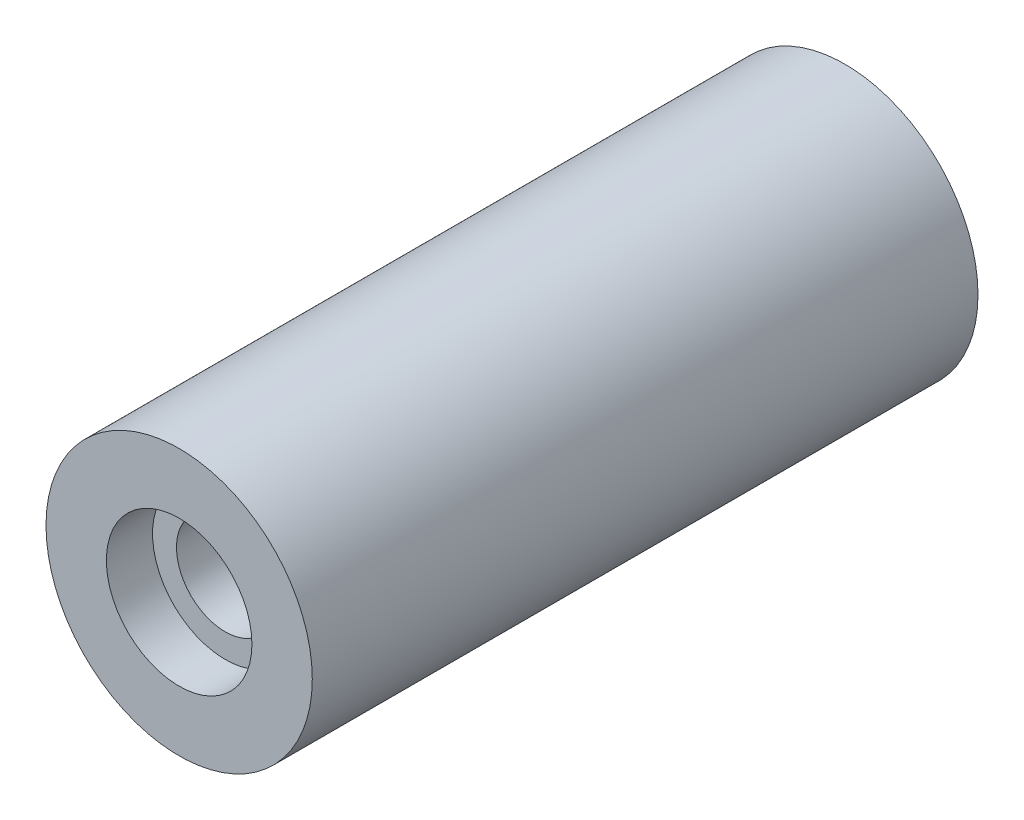
ISO-10303-21;
HEADER;
FILE_DESCRIPTION(('STEP AP214'),'2;1');
FILE_NAME('part.step','',(''),(''),'','','');
FILE_SCHEMA(('AUTOMOTIVE_DESIGN { 1 0 10303 214 1 1 1 1 }'));
ENDSEC;
DATA;
#1=APPLICATION_CONTEXT('core data for automotive mechanical design processes');
#2=APPLICATION_PROTOCOL_DEFINITION('international standard','automotive_design',2000,#1);
#3=PRODUCT_CONTEXT('',#1,'mechanical');
#4=PRODUCT('Part','Part','',(#3));
#5=PRODUCT_RELATED_PRODUCT_CATEGORY('part','',(#4));
#6=PRODUCT_DEFINITION_FORMATION('','',#4);
#7=PRODUCT_DEFINITION_CONTEXT('part definition',#1,'design');
#8=PRODUCT_DEFINITION('design','',#6,#7);
#9=PRODUCT_DEFINITION_SHAPE('','',#8);
#10=(LENGTH_UNIT() NAMED_UNIT(*) SI_UNIT(.MILLI.,.METRE.));
#11=(NAMED_UNIT(*) PLANE_ANGLE_UNIT() SI_UNIT($,.RADIAN.));
#12=(NAMED_UNIT(*) SI_UNIT($,.STERADIAN.) SOLID_ANGLE_UNIT());
#13=UNCERTAINTY_MEASURE_WITH_UNIT(LENGTH_MEASURE(1.E-05),#10,'distance_accuracy_value','');
#14=(GEOMETRIC_REPRESENTATION_CONTEXT(3) GLOBAL_UNCERTAINTY_ASSIGNED_CONTEXT((#13)) GLOBAL_UNIT_ASSIGNED_CONTEXT((#10,
#11,#12)) REPRESENTATION_CONTEXT('',''));
#15=CARTESIAN_POINT('',(0.,0.,0.));
#16=DIRECTION('',(0.,0.,1.));
#17=DIRECTION('',(1.,0.,0.));
#18=AXIS2_PLACEMENT_3D('',#15,#16,#17);
#19=CARTESIAN_POINT('',(0.,0.,75.));
#20=DIRECTION('',(0.,0.,-1.));
#21=DIRECTION('',(-1.,0.,0.));
#22=AXIS2_PLACEMENT_3D('',#19,#20,#21);
#23=CYLINDRICAL_SURFACE('',#22,15.);
#24=CARTESIAN_POINT('',(0.,0.,75.));
#25=DIRECTION('',(0.,0.,1.));
#26=DIRECTION('',(1.,0.,0.));
#27=AXIS2_PLACEMENT_3D('',#24,#25,#26);
#28=CIRCLE('',#27,15.);
#29=CARTESIAN_POINT('',(15.,0.,75.));
#30=VERTEX_POINT('',#29);
#31=EDGE_CURVE('E10',#30,#30,#28,.T.);
#32=ORIENTED_EDGE('',*,*,#31,.F.);
#33=EDGE_LOOP('',(#32));
#34=FACE_BOUND('',#33,.T.);
#35=CARTESIAN_POINT('',(0.,0.,0.));
#36=DIRECTION('',(0.,0.,1.));
#37=DIRECTION('',(1.,0.,0.));
#38=AXIS2_PLACEMENT_3D('',#35,#36,#37);
#39=CIRCLE('',#38,15.);
#40=CARTESIAN_POINT('',(15.,0.,0.));
#41=VERTEX_POINT('',#40);
#42=EDGE_CURVE('E37',#41,#41,#39,.T.);
#43=ORIENTED_EDGE('',*,*,#42,.T.);
#44=EDGE_LOOP('',(#43));
#45=FACE_BOUND('',#44,.T.);
#46=ADVANCED_FACE('F40',(#34,#45),#23,.T.);
#47=CARTESIAN_POINT('',(0.,0.,75.));
#48=DIRECTION('',(0.,0.,1.));
#49=DIRECTION('',(1.,0.,0.));
#50=AXIS2_PLACEMENT_3D('',#47,#48,#49);
#51=PLANE('',#50);
#52=CARTESIAN_POINT('',(0.,0.,75.));
#53=DIRECTION('',(0.,0.,1.));
#54=DIRECTION('',(1.,0.,0.));
#55=AXIS2_PLACEMENT_3D('',#52,#53,#54);
#56=CIRCLE('',#55,8.2);
#57=CARTESIAN_POINT('',(8.2,0.,75.));
#58=VERTEX_POINT('',#57);
#59=EDGE_CURVE('E47',#58,#58,#56,.T.);
#60=ORIENTED_EDGE('',*,*,#59,.F.);
#61=EDGE_LOOP('',(#60));
#62=FACE_BOUND('',#61,.T.);
#63=ORIENTED_EDGE('',*,*,#31,.T.);
#64=EDGE_LOOP('',(#63));
#65=FACE_BOUND('',#64,.T.);
#66=ADVANCED_FACE('F99',(#62,#65),#51,.T.);
#67=CARTESIAN_POINT('',(0.,0.,0.));
#68=DIRECTION('',(0.,0.,1.));
#69=DIRECTION('',(1.,0.,0.));
#70=AXIS2_PLACEMENT_3D('',#67,#68,#69);
#71=PLANE('',#70);
#72=CARTESIAN_POINT('',(0.,0.,0.));
#73=DIRECTION('',(0.,0.,-1.));
#74=DIRECTION('',(-1.,0.,0.));
#75=AXIS2_PLACEMENT_3D('',#72,#73,#74);
#76=CIRCLE('',#75,8.2);
#77=CARTESIAN_POINT('',(-8.2,0.,0.));
#78=VERTEX_POINT('',#77);
#79=EDGE_CURVE('E54',#78,#78,#76,.T.);
#80=ORIENTED_EDGE('',*,*,#79,.F.);
#81=EDGE_LOOP('',(#80));
#82=FACE_BOUND('',#81,.T.);
#83=ORIENTED_EDGE('',*,*,#42,.F.);
#84=EDGE_LOOP('',(#83));
#85=FACE_BOUND('',#84,.T.);
#86=ADVANCED_FACE('F96',(#82,#85),#71,.F.);
#87=CARTESIAN_POINT('',(0.,0.,69.8));
#88=DIRECTION('',(0.,0.,1.));
#89=DIRECTION('',(1.,0.,0.));
#90=AXIS2_PLACEMENT_3D('',#87,#88,#89);
#91=CYLINDRICAL_SURFACE('',#90,8.2);
#92=CARTESIAN_POINT('',(0.,0.,69.8));
#93=DIRECTION('',(0.,0.,1.));
#94=DIRECTION('',(1.,0.,0.));
#95=AXIS2_PLACEMENT_3D('',#92,#93,#94);
#96=CIRCLE('',#95,8.2);
#97=CARTESIAN_POINT('',(8.2,0.,69.8));
#98=VERTEX_POINT('',#97);
#99=EDGE_CURVE('E50',#98,#98,#96,.T.);
#100=ORIENTED_EDGE('',*,*,#99,.F.);
#101=EDGE_LOOP('',(#100));
#102=FACE_BOUND('',#101,.T.);
#103=ORIENTED_EDGE('',*,*,#59,.T.);
#104=EDGE_LOOP('',(#103));
#105=FACE_BOUND('',#104,.T.);
#106=ADVANCED_FACE('F97',(#102,#105),#91,.F.);
#107=CARTESIAN_POINT('',(0.,0.,69.8));
#108=DIRECTION('',(0.,0.,1.));
#109=DIRECTION('',(1.,0.,0.));
#110=AXIS2_PLACEMENT_3D('',#107,#108,#109);
#111=PLANE('',#110);
#112=CARTESIAN_POINT('',(0.,0.,69.8));
#113=DIRECTION('',(0.,0.,1.));
#114=DIRECTION('',(1.,0.,0.));
#115=AXIS2_PLACEMENT_3D('',#112,#113,#114);
#116=CIRCLE('',#115,5.5);
#117=CARTESIAN_POINT('',(5.5,0.,69.8));
#118=VERTEX_POINT('',#117);
#119=EDGE_CURVE('E64',#118,#118,#116,.T.);
#120=ORIENTED_EDGE('',*,*,#119,.F.);
#121=EDGE_LOOP('',(#120));
#122=FACE_BOUND('',#121,.T.);
#123=ORIENTED_EDGE('',*,*,#99,.T.);
#124=EDGE_LOOP('',(#123));
#125=FACE_BOUND('',#124,.T.);
#126=ADVANCED_FACE('F95',(#122,#125),#111,.T.);
#127=CARTESIAN_POINT('',(0.,0.,5.2));
#128=DIRECTION('',(0.,0.,-1.));
#129=DIRECTION('',(-1.,0.,0.));
#130=AXIS2_PLACEMENT_3D('',#127,#128,#129);
#131=CYLINDRICAL_SURFACE('',#130,8.2);
#132=CARTESIAN_POINT('',(0.,0.,5.2));
#133=DIRECTION('',(0.,0.,-1.));
#134=DIRECTION('',(-1.,0.,0.));
#135=AXIS2_PLACEMENT_3D('',#132,#133,#134);
#136=CIRCLE('',#135,8.2);
#137=CARTESIAN_POINT('',(-8.2,0.,5.2));
#138=VERTEX_POINT('',#137);
#139=EDGE_CURVE('E55',#138,#138,#136,.T.);
#140=ORIENTED_EDGE('',*,*,#139,.F.);
#141=EDGE_LOOP('',(#140));
#142=FACE_BOUND('',#141,.T.);
#143=ORIENTED_EDGE('',*,*,#79,.T.);
#144=EDGE_LOOP('',(#143));
#145=FACE_BOUND('',#144,.T.);
#146=ADVANCED_FACE('F88',(#142,#145),#131,.F.);
#147=CARTESIAN_POINT('',(0.,0.,5.2));
#148=DIRECTION('',(0.,0.,-1.));
#149=DIRECTION('',(-1.,0.,0.));
#150=AXIS2_PLACEMENT_3D('',#147,#148,#149);
#151=PLANE('',#150);
#152=CARTESIAN_POINT('',(0.,0.,5.2));
#153=DIRECTION('',(0.,0.,-1.));
#154=DIRECTION('',(-1.,0.,0.));
#155=AXIS2_PLACEMENT_3D('',#152,#153,#154);
#156=CIRCLE('',#155,5.5);
#157=CARTESIAN_POINT('',(-5.5,0.,5.2));
#158=VERTEX_POINT('',#157);
#159=EDGE_CURVE('E69',#158,#158,#156,.T.);
#160=ORIENTED_EDGE('',*,*,#159,.F.);
#161=EDGE_LOOP('',(#160));
#162=FACE_BOUND('',#161,.T.);
#163=ORIENTED_EDGE('',*,*,#139,.T.);
#164=EDGE_LOOP('',(#163));
#165=FACE_BOUND('',#164,.T.);
#166=ADVANCED_FACE('F84',(#162,#165),#151,.T.);
#167=CARTESIAN_POINT('',(0.,0.,44.8));
#168=DIRECTION('',(0.,0.,1.));
#169=DIRECTION('',(1.,0.,0.));
#170=AXIS2_PLACEMENT_3D('',#167,#168,#169);
#171=CYLINDRICAL_SURFACE('',#170,5.5);
#172=CARTESIAN_POINT('',(0.,0.,44.8));
#173=DIRECTION('',(0.,0.,1.));
#174=DIRECTION('',(1.,0.,0.));
#175=AXIS2_PLACEMENT_3D('',#172,#173,#174);
#176=CIRCLE('',#175,5.5);
#177=CARTESIAN_POINT('',(5.5,0.,44.8));
#178=VERTEX_POINT('',#177);
#179=EDGE_CURVE('E59',#178,#178,#176,.T.);
#180=ORIENTED_EDGE('',*,*,#179,.F.);
#181=EDGE_LOOP('',(#180));
#182=FACE_BOUND('',#181,.T.);
#183=ORIENTED_EDGE('',*,*,#119,.T.);
#184=EDGE_LOOP('',(#183));
#185=FACE_BOUND('',#184,.T.);
#186=ADVANCED_FACE('F83',(#182,#185),#171,.F.);
#187=CARTESIAN_POINT('',(0.,0.,44.8));
#188=DIRECTION('',(0.,0.,1.));
#189=DIRECTION('',(1.,0.,0.));
#190=AXIS2_PLACEMENT_3D('',#187,#188,#189);
#191=PLANE('',#190);
#192=ORIENTED_EDGE('',*,*,#179,.T.);
#193=EDGE_LOOP('',(#192));
#194=FACE_BOUND('',#193,.T.);
#195=ADVANCED_FACE('F80',(#194),#191,.T.);
#196=CARTESIAN_POINT('',(0.,0.,30.2));
#197=DIRECTION('',(0.,0.,-1.));
#198=DIRECTION('',(-1.,0.,0.));
#199=AXIS2_PLACEMENT_3D('',#196,#197,#198);
#200=CYLINDRICAL_SURFACE('',#199,5.5);
#201=CARTESIAN_POINT('',(0.,0.,30.2));
#202=DIRECTION('',(0.,0.,-1.));
#203=DIRECTION('',(-1.,0.,0.));
#204=AXIS2_PLACEMENT_3D('',#201,#202,#203);
#205=CIRCLE('',#204,5.5);
#206=CARTESIAN_POINT('',(-5.5,0.,30.2));
#207=VERTEX_POINT('',#206);
#208=EDGE_CURVE('E63',#207,#207,#205,.T.);
#209=ORIENTED_EDGE('',*,*,#208,.F.);
#210=EDGE_LOOP('',(#209));
#211=FACE_BOUND('',#210,.T.);
#212=ORIENTED_EDGE('',*,*,#159,.T.);
#213=EDGE_LOOP('',(#212));
#214=FACE_BOUND('',#213,.T.);
#215=ADVANCED_FACE('F73',(#211,#214),#200,.F.);
#216=CARTESIAN_POINT('',(0.,0.,30.2));
#217=DIRECTION('',(0.,0.,-1.));
#218=DIRECTION('',(-1.,0.,0.));
#219=AXIS2_PLACEMENT_3D('',#216,#217,#218);
#220=PLANE('',#219);
#221=ORIENTED_EDGE('',*,*,#208,.T.);
#222=EDGE_LOOP('',(#221));
#223=FACE_BOUND('',#222,.T.);
#224=ADVANCED_FACE('F71',(#223),#220,.T.);
#225=CLOSED_SHELL('',(#46,#66,#86,#106,#126,#146,#166,#186,#195,#215,#224));
#226=MANIFOLD_SOLID_BREP('B2',#225);
#227=ADVANCED_BREP_SHAPE_REPRESENTATION('',(#18,#226),#14);
#228=SHAPE_DEFINITION_REPRESENTATION(#9,#227);
ENDSEC;
END-ISO-10303-21;
